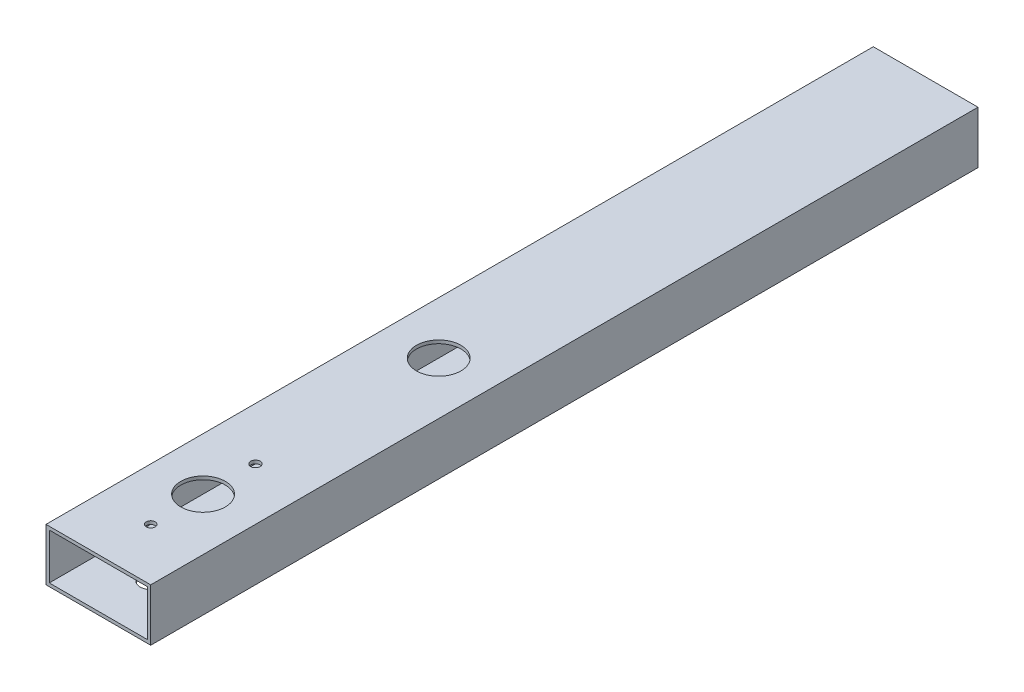
ISO-10303-21;
HEADER;
FILE_DESCRIPTION(('STEP AP214'),'2;1');
FILE_NAME('part.step','',(''),(''),'','','');
FILE_SCHEMA(('AUTOMOTIVE_DESIGN { 1 0 10303 214 1 1 1 1 }'));
ENDSEC;
DATA;
#1=APPLICATION_CONTEXT('core data for automotive mechanical design processes');
#2=APPLICATION_PROTOCOL_DEFINITION('international standard','automotive_design',2000,#1);
#3=PRODUCT_CONTEXT('',#1,'mechanical');
#4=PRODUCT('Part','Part','',(#3));
#5=PRODUCT_RELATED_PRODUCT_CATEGORY('part','',(#4));
#6=PRODUCT_DEFINITION_FORMATION('','',#4);
#7=PRODUCT_DEFINITION_CONTEXT('part definition',#1,'design');
#8=PRODUCT_DEFINITION('design','',#6,#7);
#9=PRODUCT_DEFINITION_SHAPE('','',#8);
#10=(LENGTH_UNIT() NAMED_UNIT(*) SI_UNIT(.MILLI.,.METRE.));
#11=(NAMED_UNIT(*) PLANE_ANGLE_UNIT() SI_UNIT($,.RADIAN.));
#12=(NAMED_UNIT(*) SI_UNIT($,.STERADIAN.) SOLID_ANGLE_UNIT());
#13=UNCERTAINTY_MEASURE_WITH_UNIT(LENGTH_MEASURE(1.E-05),#10,'distance_accuracy_value','');
#14=(GEOMETRIC_REPRESENTATION_CONTEXT(3) GLOBAL_UNCERTAINTY_ASSIGNED_CONTEXT((#13)) GLOBAL_UNIT_ASSIGNED_CONTEXT((#10,
#11,#12)) REPRESENTATION_CONTEXT('',''));
#15=CARTESIAN_POINT('',(0.,0.,0.));
#16=DIRECTION('',(0.,0.,1.));
#17=DIRECTION('',(1.,0.,0.));
#18=AXIS2_PLACEMENT_3D('',#15,#16,#17);
#19=CARTESIAN_POINT('',(0.,0.,401.32));
#20=DIRECTION('',(0.,0.,-1.));
#21=DIRECTION('',(-1.,0.,0.));
#22=AXIS2_PLACEMENT_3D('',#19,#20,#21);
#23=PLANE('',#22);
#24=DIRECTION('',(0.,-1.,0.));
#25=VECTOR('',#24,1.);
#26=CARTESIAN_POINT('',(0.,0.,401.32));
#27=LINE('',#26,#25);
#28=CARTESIAN_POINT('',(0.,25.4,401.32));
#29=VERTEX_POINT('',#28);
#30=CARTESIAN_POINT('',(0.,0.,401.32));
#31=VERTEX_POINT('',#30);
#32=EDGE_CURVE('E138',#29,#31,#27,.T.);
#33=ORIENTED_EDGE('',*,*,#32,.T.);
#34=DIRECTION('',(1.,0.,0.));
#35=VECTOR('',#34,1.);
#36=CARTESIAN_POINT('',(0.,0.,401.32));
#37=LINE('',#36,#35);
#38=CARTESIAN_POINT('',(50.8,0.,401.32));
#39=VERTEX_POINT('',#38);
#40=EDGE_CURVE('E141',#31,#39,#37,.T.);
#41=ORIENTED_EDGE('',*,*,#40,.T.);
#42=DIRECTION('',(0.,1.,0.));
#43=VECTOR('',#42,1.);
#44=CARTESIAN_POINT('',(50.8,0.,401.32));
#45=LINE('',#44,#43);
#46=CARTESIAN_POINT('',(50.8,25.4,401.32));
#47=VERTEX_POINT('',#46);
#48=EDGE_CURVE('E144',#39,#47,#45,.T.);
#49=ORIENTED_EDGE('',*,*,#48,.T.);
#50=DIRECTION('',(-1.,0.,0.));
#51=VECTOR('',#50,1.);
#52=CARTESIAN_POINT('',(0.,25.4,401.32));
#53=LINE('',#52,#51);
#54=EDGE_CURVE('E146',#47,#29,#53,.T.);
#55=ORIENTED_EDGE('',*,*,#54,.T.);
#56=EDGE_LOOP('',(#33,#41,#49,#55));
#57=FACE_BOUND('',#56,.T.);
#58=DIRECTION('',(1.,0.,0.));
#59=VECTOR('',#58,1.);
#60=CARTESIAN_POINT('',(1.5875,1.5875,401.32));
#61=LINE('',#60,#59);
#62=CARTESIAN_POINT('',(1.5875,1.5875,401.32));
#63=VERTEX_POINT('',#62);
#64=CARTESIAN_POINT('',(49.2125,1.5875,401.32));
#65=VERTEX_POINT('',#64);
#66=EDGE_CURVE('E100',#63,#65,#61,.T.);
#67=ORIENTED_EDGE('',*,*,#66,.F.);
#68=DIRECTION('',(0.,-1.,0.));
#69=VECTOR('',#68,1.);
#70=CARTESIAN_POINT('',(1.5875,1.5875,401.32));
#71=LINE('',#70,#69);
#72=CARTESIAN_POINT('',(1.5875,23.8125,401.32));
#73=VERTEX_POINT('',#72);
#74=EDGE_CURVE('E122',#73,#63,#71,.T.);
#75=ORIENTED_EDGE('',*,*,#74,.F.);
#76=DIRECTION('',(-1.,0.,0.));
#77=VECTOR('',#76,1.);
#78=CARTESIAN_POINT('',(1.5875,23.8125,401.32));
#79=LINE('',#78,#77);
#80=CARTESIAN_POINT('',(49.2125,23.8125,401.32));
#81=VERTEX_POINT('',#80);
#82=EDGE_CURVE('E120',#81,#73,#79,.T.);
#83=ORIENTED_EDGE('',*,*,#82,.F.);
#84=DIRECTION('',(0.,1.,0.));
#85=VECTOR('',#84,1.);
#86=CARTESIAN_POINT('',(49.2125,1.5875,401.32));
#87=LINE('',#86,#85);
#88=EDGE_CURVE('E108',#65,#81,#87,.T.);
#89=ORIENTED_EDGE('',*,*,#88,.F.);
#90=EDGE_LOOP('',(#67,#75,#83,#89));
#91=FACE_BOUND('',#90,.T.);
#92=ADVANCED_FACE('F33',(#57,#91),#23,.F.);
#93=CARTESIAN_POINT('',(0.,0.,0.));
#94=DIRECTION('',(0.,0.,-1.));
#95=DIRECTION('',(-1.,0.,0.));
#96=AXIS2_PLACEMENT_3D('',#93,#94,#95);
#97=PLANE('',#96);
#98=DIRECTION('',(0.,-1.,0.));
#99=VECTOR('',#98,1.);
#100=CARTESIAN_POINT('',(0.,0.,0.));
#101=LINE('',#100,#99);
#102=CARTESIAN_POINT('',(0.,25.4,0.));
#103=VERTEX_POINT('',#102);
#104=CARTESIAN_POINT('',(0.,0.,0.));
#105=VERTEX_POINT('',#104);
#106=EDGE_CURVE('E116',#103,#105,#101,.T.);
#107=ORIENTED_EDGE('',*,*,#106,.F.);
#108=DIRECTION('',(-1.,0.,0.));
#109=VECTOR('',#108,1.);
#110=CARTESIAN_POINT('',(0.,25.4,0.));
#111=LINE('',#110,#109);
#112=CARTESIAN_POINT('',(50.8,25.4,0.));
#113=VERTEX_POINT('',#112);
#114=EDGE_CURVE('E142',#113,#103,#111,.T.);
#115=ORIENTED_EDGE('',*,*,#114,.F.);
#116=DIRECTION('',(0.,1.,0.));
#117=VECTOR('',#116,1.);
#118=CARTESIAN_POINT('',(50.8,0.,0.));
#119=LINE('',#118,#117);
#120=CARTESIAN_POINT('',(50.8,0.,0.));
#121=VERTEX_POINT('',#120);
#122=EDGE_CURVE('E153',#121,#113,#119,.T.);
#123=ORIENTED_EDGE('',*,*,#122,.F.);
#124=DIRECTION('',(1.,0.,0.));
#125=VECTOR('',#124,1.);
#126=CARTESIAN_POINT('',(0.,0.,0.));
#127=LINE('',#126,#125);
#128=EDGE_CURVE('E151',#105,#121,#127,.T.);
#129=ORIENTED_EDGE('',*,*,#128,.F.);
#130=EDGE_LOOP('',(#107,#115,#123,#129));
#131=FACE_BOUND('',#130,.T.);
#132=DIRECTION('',(0.,-1.,0.));
#133=VECTOR('',#132,1.);
#134=CARTESIAN_POINT('',(1.5875,1.5875,0.));
#135=LINE('',#134,#133);
#136=CARTESIAN_POINT('',(1.5875,23.8125,0.));
#137=VERTEX_POINT('',#136);
#138=CARTESIAN_POINT('',(1.5875,1.5875,0.));
#139=VERTEX_POINT('',#138);
#140=EDGE_CURVE('E109',#137,#139,#135,.T.);
#141=ORIENTED_EDGE('',*,*,#140,.T.);
#142=DIRECTION('',(1.,0.,0.));
#143=VECTOR('',#142,1.);
#144=CARTESIAN_POINT('',(1.5875,1.5875,0.));
#145=LINE('',#144,#143);
#146=CARTESIAN_POINT('',(49.2125,1.5875,0.));
#147=VERTEX_POINT('',#146);
#148=EDGE_CURVE('E58',#139,#147,#145,.T.);
#149=ORIENTED_EDGE('',*,*,#148,.T.);
#150=DIRECTION('',(0.,1.,0.));
#151=VECTOR('',#150,1.);
#152=CARTESIAN_POINT('',(49.2125,1.5875,0.));
#153=LINE('',#152,#151);
#154=CARTESIAN_POINT('',(49.2125,23.8125,0.));
#155=VERTEX_POINT('',#154);
#156=EDGE_CURVE('E115',#147,#155,#153,.T.);
#157=ORIENTED_EDGE('',*,*,#156,.T.);
#158=DIRECTION('',(-1.,0.,0.));
#159=VECTOR('',#158,1.);
#160=CARTESIAN_POINT('',(1.5875,23.8125,0.));
#161=LINE('',#160,#159);
#162=EDGE_CURVE('E130',#155,#137,#161,.T.);
#163=ORIENTED_EDGE('',*,*,#162,.T.);
#164=EDGE_LOOP('',(#141,#149,#157,#163));
#165=FACE_BOUND('',#164,.T.);
#166=ADVANCED_FACE('F218',(#131,#165),#97,.T.);
#167=CARTESIAN_POINT('',(0.,0.,401.32));
#168=DIRECTION('',(1.,0.,0.));
#169=DIRECTION('',(0.,0.,-1.));
#170=AXIS2_PLACEMENT_3D('',#167,#168,#169);
#171=PLANE('',#170);
#172=ORIENTED_EDGE('',*,*,#106,.T.);
#173=DIRECTION('',(0.,0.,-1.));
#174=VECTOR('',#173,1.);
#175=CARTESIAN_POINT('',(0.,0.,401.32));
#176=LINE('',#175,#174);
#177=EDGE_CURVE('E11',#31,#105,#176,.T.);
#178=ORIENTED_EDGE('',*,*,#177,.F.);
#179=ORIENTED_EDGE('',*,*,#32,.F.);
#180=DIRECTION('',(0.,0.,-1.));
#181=VECTOR('',#180,1.);
#182=CARTESIAN_POINT('',(0.,25.4,401.32));
#183=LINE('',#182,#181);
#184=EDGE_CURVE('E148',#29,#103,#183,.T.);
#185=ORIENTED_EDGE('',*,*,#184,.T.);
#186=EDGE_LOOP('',(#172,#178,#179,#185));
#187=FACE_BOUND('',#186,.T.);
#188=ADVANCED_FACE('F35',(#187),#171,.F.);
#189=CARTESIAN_POINT('',(0.,0.,401.32));
#190=DIRECTION('',(0.,1.,0.));
#191=DIRECTION('',(0.,0.,1.));
#192=AXIS2_PLACEMENT_3D('',#189,#190,#191);
#193=PLANE('',#192);
#194=CARTESIAN_POINT('',(25.4,0.,325.12));
#195=DIRECTION('',(0.,1.,0.));
#196=DIRECTION('',(0.,0.,1.));
#197=AXIS2_PLACEMENT_3D('',#194,#195,#196);
#198=CIRCLE('',#197,5.08000000000001);
#199=CARTESIAN_POINT('',(25.4,0.,330.2));
#200=VERTEX_POINT('',#199);
#201=EDGE_CURVE('E290',#200,#200,#198,.T.);
#202=ORIENTED_EDGE('',*,*,#201,.T.);
#203=EDGE_LOOP('',(#202));
#204=FACE_BOUND('',#203,.T.);
#205=CARTESIAN_POINT('',(25.4,0.,375.92));
#206=DIRECTION('',(0.,1.,0.));
#207=DIRECTION('',(0.,0.,1.));
#208=AXIS2_PLACEMENT_3D('',#205,#206,#207);
#209=CIRCLE('',#208,5.08000000000001);
#210=CARTESIAN_POINT('',(25.4,0.,381.));
#211=VERTEX_POINT('',#210);
#212=EDGE_CURVE('E179',#211,#211,#209,.T.);
#213=ORIENTED_EDGE('',*,*,#212,.T.);
#214=EDGE_LOOP('',(#213));
#215=FACE_BOUND('',#214,.T.);
#216=CARTESIAN_POINT('',(25.4,0.,350.52));
#217=DIRECTION('',(0.,1.,0.));
#218=DIRECTION('',(0.,0.,1.));
#219=AXIS2_PLACEMENT_3D('',#216,#217,#218);
#220=CIRCLE('',#219,14.351);
#221=CARTESIAN_POINT('',(25.4,0.,364.871));
#222=VERTEX_POINT('',#221);
#223=EDGE_CURVE('E176',#222,#222,#220,.T.);
#224=ORIENTED_EDGE('',*,*,#223,.T.);
#225=EDGE_LOOP('',(#224));
#226=FACE_BOUND('',#225,.T.);
#227=CARTESIAN_POINT('',(25.4,0.,236.22));
#228=DIRECTION('',(0.,1.,0.));
#229=DIRECTION('',(0.,0.,1.));
#230=AXIS2_PLACEMENT_3D('',#227,#228,#229);
#231=CIRCLE('',#230,14.351);
#232=CARTESIAN_POINT('',(25.4,0.,250.571));
#233=VERTEX_POINT('',#232);
#234=EDGE_CURVE('E193',#233,#233,#231,.T.);
#235=ORIENTED_EDGE('',*,*,#234,.T.);
#236=EDGE_LOOP('',(#235));
#237=FACE_BOUND('',#236,.T.);
#238=ORIENTED_EDGE('',*,*,#128,.T.);
#239=DIRECTION('',(0.,0.,-1.));
#240=VECTOR('',#239,1.);
#241=CARTESIAN_POINT('',(50.8,0.,401.32));
#242=LINE('',#241,#240);
#243=EDGE_CURVE('E42',#39,#121,#242,.T.);
#244=ORIENTED_EDGE('',*,*,#243,.F.);
#245=ORIENTED_EDGE('',*,*,#40,.F.);
#246=ORIENTED_EDGE('',*,*,#177,.T.);
#247=EDGE_LOOP('',(#238,#244,#245,#246));
#248=FACE_BOUND('',#247,.T.);
#249=ADVANCED_FACE('F222',(#204,#215,#226,#237,#248),#193,.F.);
#250=CARTESIAN_POINT('',(50.8,0.,401.32));
#251=DIRECTION('',(-1.,0.,0.));
#252=DIRECTION('',(0.,0.,1.));
#253=AXIS2_PLACEMENT_3D('',#250,#251,#252);
#254=PLANE('',#253);
#255=ORIENTED_EDGE('',*,*,#122,.T.);
#256=DIRECTION('',(0.,0.,-1.));
#257=VECTOR('',#256,1.);
#258=CARTESIAN_POINT('',(50.8,25.4,401.32));
#259=LINE('',#258,#257);
#260=EDGE_CURVE('E158',#47,#113,#259,.T.);
#261=ORIENTED_EDGE('',*,*,#260,.F.);
#262=ORIENTED_EDGE('',*,*,#48,.F.);
#263=ORIENTED_EDGE('',*,*,#243,.T.);
#264=EDGE_LOOP('',(#255,#261,#262,#263));
#265=FACE_BOUND('',#264,.T.);
#266=ADVANCED_FACE('F205',(#265),#254,.F.);
#267=CARTESIAN_POINT('',(0.,25.4,401.32));
#268=DIRECTION('',(0.,-1.,0.));
#269=DIRECTION('',(0.,0.,-1.));
#270=AXIS2_PLACEMENT_3D('',#267,#268,#269);
#271=PLANE('',#270);
#272=CARTESIAN_POINT('',(25.4,25.4,325.12));
#273=DIRECTION('',(0.,1.,0.));
#274=DIRECTION('',(0.,0.,1.));
#275=AXIS2_PLACEMENT_3D('',#272,#273,#274);
#276=CIRCLE('',#275,2.28600000000001);
#277=CARTESIAN_POINT('',(25.4,25.4,327.406));
#278=VERTEX_POINT('',#277);
#279=EDGE_CURVE('E291',#278,#278,#276,.T.);
#280=ORIENTED_EDGE('',*,*,#279,.F.);
#281=EDGE_LOOP('',(#280));
#282=FACE_BOUND('',#281,.T.);
#283=CARTESIAN_POINT('',(25.4,25.4,375.92));
#284=DIRECTION('',(0.,1.,0.));
#285=DIRECTION('',(0.,0.,1.));
#286=AXIS2_PLACEMENT_3D('',#283,#284,#285);
#287=CIRCLE('',#286,2.15900000000001);
#288=CARTESIAN_POINT('',(25.4,25.4,378.079));
#289=VERTEX_POINT('',#288);
#290=EDGE_CURVE('E172',#289,#289,#287,.T.);
#291=ORIENTED_EDGE('',*,*,#290,.F.);
#292=EDGE_LOOP('',(#291));
#293=FACE_BOUND('',#292,.T.);
#294=CARTESIAN_POINT('',(25.4,25.4,350.52));
#295=DIRECTION('',(0.,1.,0.));
#296=DIRECTION('',(0.,0.,1.));
#297=AXIS2_PLACEMENT_3D('',#294,#295,#296);
#298=CIRCLE('',#297,10.795);
#299=CARTESIAN_POINT('',(25.4,25.4,361.315));
#300=VERTEX_POINT('',#299);
#301=EDGE_CURVE('E168',#300,#300,#298,.T.);
#302=ORIENTED_EDGE('',*,*,#301,.F.);
#303=EDGE_LOOP('',(#302));
#304=FACE_BOUND('',#303,.T.);
#305=CARTESIAN_POINT('',(25.4,25.4,236.22));
#306=DIRECTION('',(0.,1.,0.));
#307=DIRECTION('',(0.,0.,1.));
#308=AXIS2_PLACEMENT_3D('',#305,#306,#307);
#309=CIRCLE('',#308,10.795);
#310=CARTESIAN_POINT('',(25.4,25.4,247.015));
#311=VERTEX_POINT('',#310);
#312=EDGE_CURVE('E165',#311,#311,#309,.T.);
#313=ORIENTED_EDGE('',*,*,#312,.F.);
#314=EDGE_LOOP('',(#313));
#315=FACE_BOUND('',#314,.T.);
#316=ORIENTED_EDGE('',*,*,#114,.T.);
#317=ORIENTED_EDGE('',*,*,#184,.F.);
#318=ORIENTED_EDGE('',*,*,#54,.F.);
#319=ORIENTED_EDGE('',*,*,#260,.T.);
#320=EDGE_LOOP('',(#316,#317,#318,#319));
#321=FACE_BOUND('',#320,.T.);
#322=ADVANCED_FACE('F202',(#282,#293,#304,#315,#321),#271,.F.);
#323=CARTESIAN_POINT('',(1.5875,1.5875,401.32));
#324=DIRECTION('',(0.,1.,0.));
#325=DIRECTION('',(0.,0.,1.));
#326=AXIS2_PLACEMENT_3D('',#323,#324,#325);
#327=PLANE('',#326);
#328=CARTESIAN_POINT('',(25.4,1.5875,325.12));
#329=DIRECTION('',(0.,1.,0.));
#330=DIRECTION('',(0.,0.,1.));
#331=AXIS2_PLACEMENT_3D('',#328,#329,#330);
#332=CIRCLE('',#331,5.08000000000001);
#333=CARTESIAN_POINT('',(25.4,1.5875,330.2));
#334=VERTEX_POINT('',#333);
#335=EDGE_CURVE('E287',#334,#334,#332,.T.);
#336=ORIENTED_EDGE('',*,*,#335,.F.);
#337=EDGE_LOOP('',(#336));
#338=FACE_BOUND('',#337,.T.);
#339=CARTESIAN_POINT('',(25.4,1.5875,375.92));
#340=DIRECTION('',(0.,1.,0.));
#341=DIRECTION('',(0.,0.,1.));
#342=AXIS2_PLACEMENT_3D('',#339,#340,#341);
#343=CIRCLE('',#342,5.08000000000001);
#344=CARTESIAN_POINT('',(25.4,1.5875,381.));
#345=VERTEX_POINT('',#344);
#346=EDGE_CURVE('E184',#345,#345,#343,.T.);
#347=ORIENTED_EDGE('',*,*,#346,.F.);
#348=EDGE_LOOP('',(#347));
#349=FACE_BOUND('',#348,.T.);
#350=CARTESIAN_POINT('',(25.4,1.5875,350.52));
#351=DIRECTION('',(0.,1.,0.));
#352=DIRECTION('',(0.,0.,1.));
#353=AXIS2_PLACEMENT_3D('',#350,#351,#352);
#354=CIRCLE('',#353,14.351);
#355=CARTESIAN_POINT('',(25.4,1.5875,364.871));
#356=VERTEX_POINT('',#355);
#357=EDGE_CURVE('E171',#356,#356,#354,.T.);
#358=ORIENTED_EDGE('',*,*,#357,.F.);
#359=EDGE_LOOP('',(#358));
#360=FACE_BOUND('',#359,.T.);
#361=CARTESIAN_POINT('',(25.4,1.5875,236.22));
#362=DIRECTION('',(0.,1.,0.));
#363=DIRECTION('',(0.,0.,1.));
#364=AXIS2_PLACEMENT_3D('',#361,#362,#363);
#365=CIRCLE('',#364,14.351);
#366=CARTESIAN_POINT('',(25.4,1.5875,250.571));
#367=VERTEX_POINT('',#366);
#368=EDGE_CURVE('E190',#367,#367,#365,.T.);
#369=ORIENTED_EDGE('',*,*,#368,.F.);
#370=EDGE_LOOP('',(#369));
#371=FACE_BOUND('',#370,.T.);
#372=ORIENTED_EDGE('',*,*,#148,.F.);
#373=DIRECTION('',(0.,0.,-1.));
#374=VECTOR('',#373,1.);
#375=CARTESIAN_POINT('',(1.5875,1.5875,401.32));
#376=LINE('',#375,#374);
#377=EDGE_CURVE('E104',#63,#139,#376,.T.);
#378=ORIENTED_EDGE('',*,*,#377,.F.);
#379=ORIENTED_EDGE('',*,*,#66,.T.);
#380=DIRECTION('',(0.,0.,-1.));
#381=VECTOR('',#380,1.);
#382=CARTESIAN_POINT('',(49.2125,1.5875,401.32));
#383=LINE('',#382,#381);
#384=EDGE_CURVE('E103',#65,#147,#383,.T.);
#385=ORIENTED_EDGE('',*,*,#384,.T.);
#386=EDGE_LOOP('',(#372,#378,#379,#385));
#387=FACE_BOUND('',#386,.T.);
#388=ADVANCED_FACE('F102',(#338,#349,#360,#371,#387),#327,.T.);
#389=CARTESIAN_POINT('',(49.2125,1.5875,401.32));
#390=DIRECTION('',(-1.,0.,0.));
#391=DIRECTION('',(0.,0.,1.));
#392=AXIS2_PLACEMENT_3D('',#389,#390,#391);
#393=PLANE('',#392);
#394=ORIENTED_EDGE('',*,*,#156,.F.);
#395=ORIENTED_EDGE('',*,*,#384,.F.);
#396=ORIENTED_EDGE('',*,*,#88,.T.);
#397=DIRECTION('',(0.,0.,-1.));
#398=VECTOR('',#397,1.);
#399=CARTESIAN_POINT('',(49.2125,23.8125,401.32));
#400=LINE('',#399,#398);
#401=EDGE_CURVE('E117',#81,#155,#400,.T.);
#402=ORIENTED_EDGE('',*,*,#401,.T.);
#403=EDGE_LOOP('',(#394,#395,#396,#402));
#404=FACE_BOUND('',#403,.T.);
#405=ADVANCED_FACE('F112',(#404),#393,.T.);
#406=CARTESIAN_POINT('',(1.5875,23.8125,401.32));
#407=DIRECTION('',(0.,-1.,0.));
#408=DIRECTION('',(0.,0.,-1.));
#409=AXIS2_PLACEMENT_3D('',#406,#407,#408);
#410=PLANE('',#409);
#411=CARTESIAN_POINT('',(25.4,23.8125,325.12));
#412=DIRECTION('',(0.,-1.,0.));
#413=DIRECTION('',(0.,0.,-1.));
#414=AXIS2_PLACEMENT_3D('',#411,#412,#413);
#415=CIRCLE('',#414,2.28600000000001);
#416=CARTESIAN_POINT('',(25.4,23.8125,322.834));
#417=VERTEX_POINT('',#416);
#418=EDGE_CURVE('E37',#417,#417,#415,.T.);
#419=ORIENTED_EDGE('',*,*,#418,.F.);
#420=EDGE_LOOP('',(#419));
#421=FACE_BOUND('',#420,.T.);
#422=CARTESIAN_POINT('',(25.4,23.8125,375.92));
#423=DIRECTION('',(0.,-1.,0.));
#424=DIRECTION('',(0.,0.,-1.));
#425=AXIS2_PLACEMENT_3D('',#422,#423,#424);
#426=CIRCLE('',#425,2.15900000000001);
#427=CARTESIAN_POINT('',(25.4,23.8125,373.761));
#428=VERTEX_POINT('',#427);
#429=EDGE_CURVE('E169',#428,#428,#426,.T.);
#430=ORIENTED_EDGE('',*,*,#429,.F.);
#431=EDGE_LOOP('',(#430));
#432=FACE_BOUND('',#431,.T.);
#433=CARTESIAN_POINT('',(25.4,23.8125,350.52));
#434=DIRECTION('',(0.,-1.,0.));
#435=DIRECTION('',(0.,0.,-1.));
#436=AXIS2_PLACEMENT_3D('',#433,#434,#435);
#437=CIRCLE('',#436,10.795);
#438=CARTESIAN_POINT('',(25.4,23.8125,339.725));
#439=VERTEX_POINT('',#438);
#440=EDGE_CURVE('E166',#439,#439,#437,.T.);
#441=ORIENTED_EDGE('',*,*,#440,.F.);
#442=EDGE_LOOP('',(#441));
#443=FACE_BOUND('',#442,.T.);
#444=CARTESIAN_POINT('',(25.4,23.8125,236.22));
#445=DIRECTION('',(0.,-1.,0.));
#446=DIRECTION('',(0.,0.,-1.));
#447=AXIS2_PLACEMENT_3D('',#444,#445,#446);
#448=CIRCLE('',#447,10.795);
#449=CARTESIAN_POINT('',(25.4,23.8125,225.425));
#450=VERTEX_POINT('',#449);
#451=EDGE_CURVE('E128',#450,#450,#448,.T.);
#452=ORIENTED_EDGE('',*,*,#451,.F.);
#453=EDGE_LOOP('',(#452));
#454=FACE_BOUND('',#453,.T.);
#455=ORIENTED_EDGE('',*,*,#162,.F.);
#456=ORIENTED_EDGE('',*,*,#401,.F.);
#457=ORIENTED_EDGE('',*,*,#82,.T.);
#458=DIRECTION('',(0.,0.,-1.));
#459=VECTOR('',#458,1.);
#460=CARTESIAN_POINT('',(1.5875,23.8125,401.32));
#461=LINE('',#460,#459);
#462=EDGE_CURVE('E50',#73,#137,#461,.T.);
#463=ORIENTED_EDGE('',*,*,#462,.T.);
#464=EDGE_LOOP('',(#455,#456,#457,#463));
#465=FACE_BOUND('',#464,.T.);
#466=ADVANCED_FACE('F246',(#421,#432,#443,#454,#465),#410,.T.);
#467=CARTESIAN_POINT('',(1.5875,1.5875,401.32));
#468=DIRECTION('',(1.,0.,0.));
#469=DIRECTION('',(0.,0.,-1.));
#470=AXIS2_PLACEMENT_3D('',#467,#468,#469);
#471=PLANE('',#470);
#472=ORIENTED_EDGE('',*,*,#140,.F.);
#473=ORIENTED_EDGE('',*,*,#462,.F.);
#474=ORIENTED_EDGE('',*,*,#74,.T.);
#475=ORIENTED_EDGE('',*,*,#377,.T.);
#476=EDGE_LOOP('',(#472,#473,#474,#475));
#477=FACE_BOUND('',#476,.T.);
#478=ADVANCED_FACE('F249',(#477),#471,.T.);
#479=CARTESIAN_POINT('',(25.4,22.86,236.22));
#480=DIRECTION('',(0.,1.,0.));
#481=DIRECTION('',(0.,0.,1.));
#482=AXIS2_PLACEMENT_3D('',#479,#480,#481);
#483=CYLINDRICAL_SURFACE('',#482,10.795);
#484=ORIENTED_EDGE('',*,*,#451,.T.);
#485=EDGE_LOOP('',(#484));
#486=FACE_BOUND('',#485,.T.);
#487=ORIENTED_EDGE('',*,*,#312,.T.);
#488=EDGE_LOOP('',(#487));
#489=FACE_BOUND('',#488,.T.);
#490=ADVANCED_FACE('F200',(#486,#489),#483,.F.);
#491=CARTESIAN_POINT('',(25.4,20.48,350.52));
#492=DIRECTION('',(0.,1.,0.));
#493=DIRECTION('',(0.,0.,1.));
#494=AXIS2_PLACEMENT_3D('',#491,#492,#493);
#495=CYLINDRICAL_SURFACE('',#494,10.795);
#496=ORIENTED_EDGE('',*,*,#440,.T.);
#497=EDGE_LOOP('',(#496));
#498=FACE_BOUND('',#497,.T.);
#499=ORIENTED_EDGE('',*,*,#301,.T.);
#500=EDGE_LOOP('',(#499));
#501=FACE_BOUND('',#500,.T.);
#502=ADVANCED_FACE('F255',(#498,#501),#495,.F.);
#503=CARTESIAN_POINT('',(25.4,-11.1125,236.22));
#504=DIRECTION('',(0.,1.,0.));
#505=DIRECTION('',(0.,0.,1.));
#506=AXIS2_PLACEMENT_3D('',#503,#504,#505);
#507=CYLINDRICAL_SURFACE('',#506,14.351);
#508=CARTESIAN_POINT('',(25.4,1.5875,250.571));
#509=CARTESIAN_POINT('',(25.4,1.57096354166667,250.571));
#510=CARTESIAN_POINT('',(25.4,1.55442708333333,250.571));
#511=CARTESIAN_POINT('',(25.4,1.52135416666667,250.571));
#512=CARTESIAN_POINT('',(25.4,1.50481770833333,250.571));
#513=CARTESIAN_POINT('',(25.4,1.47174479166667,250.571));
#514=CARTESIAN_POINT('',(25.4,1.45520833333333,250.571));
#515=CARTESIAN_POINT('',(25.4,1.42213541666667,250.571));
#516=CARTESIAN_POINT('',(25.4,1.40559895833333,250.571));
#517=CARTESIAN_POINT('',(25.4,1.37252604166667,250.571));
#518=CARTESIAN_POINT('',(25.4,1.35598958333333,250.571));
#519=CARTESIAN_POINT('',(25.4,1.32291666666667,250.571));
#520=CARTESIAN_POINT('',(25.4,1.30638020833333,250.571));
#521=CARTESIAN_POINT('',(25.4,1.27330729166667,250.571));
#522=CARTESIAN_POINT('',(25.4,1.25677083333333,250.571));
#523=CARTESIAN_POINT('',(25.4,1.22369791666667,250.571));
#524=CARTESIAN_POINT('',(25.4,1.20716145833333,250.571));
#525=CARTESIAN_POINT('',(25.4,1.17408854166667,250.571));
#526=CARTESIAN_POINT('',(25.4,1.15755208333333,250.571));
#527=CARTESIAN_POINT('',(25.4,1.12447916666667,250.571));
#528=CARTESIAN_POINT('',(25.4,1.10794270833333,250.571));
#529=CARTESIAN_POINT('',(25.4,1.07486979166667,250.571));
#530=CARTESIAN_POINT('',(25.4,1.05833333333333,250.571));
#531=CARTESIAN_POINT('',(25.4,1.02526041666667,250.571));
#532=CARTESIAN_POINT('',(25.4,1.00872395833333,250.571));
#533=CARTESIAN_POINT('',(25.4,0.975651041666666,250.571));
#534=CARTESIAN_POINT('',(25.4,0.959114583333333,250.571));
#535=CARTESIAN_POINT('',(25.4,0.926041666666666,250.571));
#536=CARTESIAN_POINT('',(25.4,0.909505208333332,250.571));
#537=CARTESIAN_POINT('',(25.4,0.876432291666666,250.571));
#538=CARTESIAN_POINT('',(25.4,0.859895833333333,250.571));
#539=CARTESIAN_POINT('',(25.4,0.826822916666666,250.571));
#540=CARTESIAN_POINT('',(25.4,0.810286458333333,250.571));
#541=CARTESIAN_POINT('',(25.4,0.777213541666666,250.571));
#542=CARTESIAN_POINT('',(25.4,0.760677083333332,250.571));
#543=CARTESIAN_POINT('',(25.4,0.727604166666666,250.571));
#544=CARTESIAN_POINT('',(25.4,0.711067708333333,250.571));
#545=CARTESIAN_POINT('',(25.4,0.677994791666666,250.571));
#546=CARTESIAN_POINT('',(25.4,0.661458333333333,250.571));
#547=CARTESIAN_POINT('',(25.4,0.628385416666666,250.571));
#548=CARTESIAN_POINT('',(25.4,0.611848958333332,250.571));
#549=CARTESIAN_POINT('',(25.4,0.578776041666666,250.571));
#550=CARTESIAN_POINT('',(25.4,0.562239583333333,250.571));
#551=CARTESIAN_POINT('',(25.4,0.529166666666666,250.571));
#552=CARTESIAN_POINT('',(25.4,0.512630208333333,250.571));
#553=CARTESIAN_POINT('',(25.4,0.479557291666666,250.571));
#554=CARTESIAN_POINT('',(25.4,0.463020833333332,250.571));
#555=CARTESIAN_POINT('',(25.4,0.429947916666666,250.571));
#556=CARTESIAN_POINT('',(25.4,0.413411458333333,250.571));
#557=CARTESIAN_POINT('',(25.4,0.380338541666666,250.571));
#558=CARTESIAN_POINT('',(25.4,0.363802083333333,250.571));
#559=CARTESIAN_POINT('',(25.4,0.330729166666666,250.571));
#560=CARTESIAN_POINT('',(25.4,0.314192708333332,250.571));
#561=CARTESIAN_POINT('',(25.4,0.281119791666665,250.571));
#562=CARTESIAN_POINT('',(25.4,0.264583333333333,250.571));
#563=CARTESIAN_POINT('',(25.4,0.231510416666666,250.571));
#564=CARTESIAN_POINT('',(25.4,0.214973958333332,250.571));
#565=CARTESIAN_POINT('',(25.4,0.181901041666665,250.571));
#566=CARTESIAN_POINT('',(25.4,0.165364583333332,250.571));
#567=CARTESIAN_POINT('',(25.4,0.132291666666665,250.571));
#568=CARTESIAN_POINT('',(25.4,0.115755208333331,250.571));
#569=CARTESIAN_POINT('',(25.4,0.0826822916666648,250.571));
#570=CARTESIAN_POINT('',(25.4,0.0661458333333318,250.571));
#571=CARTESIAN_POINT('',(25.4,0.0330729166666653,250.571));
#572=CARTESIAN_POINT('',(25.4,0.0165364583333318,250.571));
#573=CARTESIAN_POINT('',(25.4,0.,250.571));
#574=B_SPLINE_CURVE_WITH_KNOTS('',3,(#508,#509,#510,#511,#512,#513,#514,#515,#516,#517,#518,
#519,#520,#521,#522,#523,#524,#525,#526,#527,#528,#529,#530,#531,#532,#533,#534,#535,#536,#537,
#538,#539,#540,#541,#542,#543,#544,#545,#546,#547,#548,#549,#550,#551,#552,#553,#554,#555,#556,
#557,#558,#559,#560,#561,#562,#563,#564,#565,#566,#567,#568,#569,#570,#571,#572,#573),
.UNSPECIFIED.,.F.,.F.,(4,2,2,2,2,2,2,2,2,2,2,2,2,2,2,2,2,2,2,2,2,2,2,2,2,2,2,2,2,2,2,2,4),(0.,
0.0496093750000006,0.0992187499999995,0.148828125,0.198437500000001,0.248046875,0.29765625,
0.347265625000001,0.396875000000001,0.446484375,0.496093750000001,0.545703125000002,0.5953125,
0.644921875000001,0.694531250000002,0.744140625,0.793750000000001,0.843359375000002,
0.892968750000001,0.942578125000001,0.992187500000002,1.041796875,1.09140625,1.141015625,
1.190625,1.240234375,1.28984375,1.339453125,1.3890625,1.438671875,1.48828125,1.537890625,
1.5875),.UNSPECIFIED.);
#575=EDGE_CURVE('BSEAM259',#367,#233,#574,.T.);
#576=ORIENTED_EDGE('',*,*,#368,.T.);
#577=ORIENTED_EDGE('',*,*,#234,.F.);
#578=ORIENTED_EDGE('',*,*,#575,.T.);
#579=ORIENTED_EDGE('',*,*,#575,.F.);
#580=EDGE_LOOP('',(#576,#578,#577,#579));
#581=FACE_BOUND('',#580,.T.);
#582=ADVANCED_FACE('F259',(#581),#507,.F.);
#583=CARTESIAN_POINT('',(25.4,-11.1125,350.52));
#584=DIRECTION('',(0.,1.,0.));
#585=DIRECTION('',(0.,0.,1.));
#586=AXIS2_PLACEMENT_3D('',#583,#584,#585);
#587=CYLINDRICAL_SURFACE('',#586,14.351);
#588=CARTESIAN_POINT('',(25.4,1.5875,364.871));
#589=CARTESIAN_POINT('',(25.4,1.57096354166667,364.871));
#590=CARTESIAN_POINT('',(25.4,1.55442708333333,364.871));
#591=CARTESIAN_POINT('',(25.4,1.52135416666667,364.871));
#592=CARTESIAN_POINT('',(25.4,1.50481770833333,364.871));
#593=CARTESIAN_POINT('',(25.4,1.47174479166667,364.871));
#594=CARTESIAN_POINT('',(25.4,1.45520833333333,364.871));
#595=CARTESIAN_POINT('',(25.4,1.42213541666667,364.871));
#596=CARTESIAN_POINT('',(25.4,1.40559895833333,364.871));
#597=CARTESIAN_POINT('',(25.4,1.37252604166667,364.871));
#598=CARTESIAN_POINT('',(25.4,1.35598958333333,364.871));
#599=CARTESIAN_POINT('',(25.4,1.32291666666667,364.871));
#600=CARTESIAN_POINT('',(25.4,1.30638020833333,364.871));
#601=CARTESIAN_POINT('',(25.4,1.27330729166667,364.871));
#602=CARTESIAN_POINT('',(25.4,1.25677083333333,364.871));
#603=CARTESIAN_POINT('',(25.4,1.22369791666667,364.871));
#604=CARTESIAN_POINT('',(25.4,1.20716145833333,364.871));
#605=CARTESIAN_POINT('',(25.4,1.17408854166667,364.871));
#606=CARTESIAN_POINT('',(25.4,1.15755208333333,364.871));
#607=CARTESIAN_POINT('',(25.4,1.12447916666667,364.871));
#608=CARTESIAN_POINT('',(25.4,1.10794270833333,364.871));
#609=CARTESIAN_POINT('',(25.4,1.07486979166667,364.871));
#610=CARTESIAN_POINT('',(25.4,1.05833333333333,364.871));
#611=CARTESIAN_POINT('',(25.4,1.02526041666667,364.871));
#612=CARTESIAN_POINT('',(25.4,1.00872395833333,364.871));
#613=CARTESIAN_POINT('',(25.4,0.975651041666666,364.871));
#614=CARTESIAN_POINT('',(25.4,0.959114583333333,364.871));
#615=CARTESIAN_POINT('',(25.4,0.926041666666666,364.871));
#616=CARTESIAN_POINT('',(25.4,0.909505208333332,364.871));
#617=CARTESIAN_POINT('',(25.4,0.876432291666666,364.871));
#618=CARTESIAN_POINT('',(25.4,0.859895833333333,364.871));
#619=CARTESIAN_POINT('',(25.4,0.826822916666666,364.871));
#620=CARTESIAN_POINT('',(25.4,0.810286458333333,364.871));
#621=CARTESIAN_POINT('',(25.4,0.777213541666666,364.871));
#622=CARTESIAN_POINT('',(25.4,0.760677083333332,364.871));
#623=CARTESIAN_POINT('',(25.4,0.727604166666666,364.871));
#624=CARTESIAN_POINT('',(25.4,0.711067708333333,364.871));
#625=CARTESIAN_POINT('',(25.4,0.677994791666666,364.871));
#626=CARTESIAN_POINT('',(25.4,0.661458333333333,364.871));
#627=CARTESIAN_POINT('',(25.4,0.628385416666666,364.871));
#628=CARTESIAN_POINT('',(25.4,0.611848958333332,364.871));
#629=CARTESIAN_POINT('',(25.4,0.578776041666666,364.871));
#630=CARTESIAN_POINT('',(25.4,0.562239583333333,364.871));
#631=CARTESIAN_POINT('',(25.4,0.529166666666666,364.871));
#632=CARTESIAN_POINT('',(25.4,0.512630208333333,364.871));
#633=CARTESIAN_POINT('',(25.4,0.479557291666666,364.871));
#634=CARTESIAN_POINT('',(25.4,0.463020833333332,364.871));
#635=CARTESIAN_POINT('',(25.4,0.429947916666666,364.871));
#636=CARTESIAN_POINT('',(25.4,0.413411458333333,364.871));
#637=CARTESIAN_POINT('',(25.4,0.380338541666666,364.871));
#638=CARTESIAN_POINT('',(25.4,0.363802083333333,364.871));
#639=CARTESIAN_POINT('',(25.4,0.330729166666666,364.871));
#640=CARTESIAN_POINT('',(25.4,0.314192708333332,364.871));
#641=CARTESIAN_POINT('',(25.4,0.281119791666665,364.871));
#642=CARTESIAN_POINT('',(25.4,0.264583333333333,364.871));
#643=CARTESIAN_POINT('',(25.4,0.231510416666666,364.871));
#644=CARTESIAN_POINT('',(25.4,0.214973958333332,364.871));
#645=CARTESIAN_POINT('',(25.4,0.181901041666665,364.871));
#646=CARTESIAN_POINT('',(25.4,0.165364583333332,364.871));
#647=CARTESIAN_POINT('',(25.4,0.132291666666665,364.871));
#648=CARTESIAN_POINT('',(25.4,0.115755208333331,364.871));
#649=CARTESIAN_POINT('',(25.4,0.0826822916666648,364.871));
#650=CARTESIAN_POINT('',(25.4,0.0661458333333318,364.871));
#651=CARTESIAN_POINT('',(25.4,0.0330729166666653,364.871));
#652=CARTESIAN_POINT('',(25.4,0.0165364583333318,364.871));
#653=CARTESIAN_POINT('',(25.4,0.,364.871));
#654=B_SPLINE_CURVE_WITH_KNOTS('',3,(#588,#589,#590,#591,#592,#593,#594,#595,#596,#597,#598,
#599,#600,#601,#602,#603,#604,#605,#606,#607,#608,#609,#610,#611,#612,#613,#614,#615,#616,#617,
#618,#619,#620,#621,#622,#623,#624,#625,#626,#627,#628,#629,#630,#631,#632,#633,#634,#635,#636,
#637,#638,#639,#640,#641,#642,#643,#644,#645,#646,#647,#648,#649,#650,#651,#652,#653),
.UNSPECIFIED.,.F.,.F.,(4,2,2,2,2,2,2,2,2,2,2,2,2,2,2,2,2,2,2,2,2,2,2,2,2,2,2,2,2,2,2,2,4),(0.,
0.0496093750000006,0.0992187499999995,0.148828125,0.198437500000001,0.248046875,0.29765625,
0.347265625000001,0.396875000000001,0.446484375,0.496093750000001,0.545703125000002,0.5953125,
0.644921875000001,0.694531250000002,0.744140625,0.793750000000001,0.843359375000002,
0.892968750000001,0.942578125000001,0.992187500000002,1.041796875,1.09140625,1.141015625,
1.190625,1.240234375,1.28984375,1.339453125,1.3890625,1.438671875,1.48828125,1.537890625,
1.5875),.UNSPECIFIED.);
#655=EDGE_CURVE('BSEAM263',#356,#222,#654,.T.);
#656=ORIENTED_EDGE('',*,*,#357,.T.);
#657=ORIENTED_EDGE('',*,*,#223,.F.);
#658=ORIENTED_EDGE('',*,*,#655,.T.);
#659=ORIENTED_EDGE('',*,*,#655,.F.);
#660=EDGE_LOOP('',(#656,#658,#657,#659));
#661=FACE_BOUND('',#660,.T.);
#662=ADVANCED_FACE('F263',(#661),#587,.F.);
#663=CARTESIAN_POINT('',(25.4,22.86,375.92));
#664=DIRECTION('',(0.,1.,0.));
#665=DIRECTION('',(0.,0.,1.));
#666=AXIS2_PLACEMENT_3D('',#663,#664,#665);
#667=CYLINDRICAL_SURFACE('',#666,2.15900000000001);
#668=ORIENTED_EDGE('',*,*,#429,.T.);
#669=EDGE_LOOP('',(#668));
#670=FACE_BOUND('',#669,.T.);
#671=ORIENTED_EDGE('',*,*,#290,.T.);
#672=EDGE_LOOP('',(#671));
#673=FACE_BOUND('',#672,.T.);
#674=ADVANCED_FACE('F267',(#670,#673),#667,.F.);
#675=CARTESIAN_POINT('',(25.4,-0.952499999999999,375.92));
#676=DIRECTION('',(0.,1.,0.));
#677=DIRECTION('',(0.,0.,1.));
#678=AXIS2_PLACEMENT_3D('',#675,#676,#677);
#679=CYLINDRICAL_SURFACE('',#678,5.08000000000001);
#680=ORIENTED_EDGE('',*,*,#346,.T.);
#681=EDGE_LOOP('',(#680));
#682=FACE_BOUND('',#681,.T.);
#683=ORIENTED_EDGE('',*,*,#212,.F.);
#684=EDGE_LOOP('',(#683));
#685=FACE_BOUND('',#684,.T.);
#686=ADVANCED_FACE('F271',(#682,#685),#679,.F.);
#687=CARTESIAN_POINT('',(25.4,22.86,325.12));
#688=DIRECTION('',(0.,1.,0.));
#689=DIRECTION('',(0.,0.,1.));
#690=AXIS2_PLACEMENT_3D('',#687,#688,#689);
#691=CYLINDRICAL_SURFACE('',#690,2.28600000000001);
#692=ORIENTED_EDGE('',*,*,#418,.T.);
#693=EDGE_LOOP('',(#692));
#694=FACE_BOUND('',#693,.T.);
#695=ORIENTED_EDGE('',*,*,#279,.T.);
#696=EDGE_LOOP('',(#695));
#697=FACE_BOUND('',#696,.T.);
#698=ADVANCED_FACE('F274',(#694,#697),#691,.F.);
#699=CARTESIAN_POINT('',(25.4,-0.952499999999999,325.12));
#700=DIRECTION('',(0.,1.,0.));
#701=DIRECTION('',(0.,0.,1.));
#702=AXIS2_PLACEMENT_3D('',#699,#700,#701);
#703=CYLINDRICAL_SURFACE('',#702,5.08000000000001);
#704=ORIENTED_EDGE('',*,*,#335,.T.);
#705=EDGE_LOOP('',(#704));
#706=FACE_BOUND('',#705,.T.);
#707=ORIENTED_EDGE('',*,*,#201,.F.);
#708=EDGE_LOOP('',(#707));
#709=FACE_BOUND('',#708,.T.);
#710=ADVANCED_FACE('F278',(#706,#709),#703,.F.);
#711=CLOSED_SHELL('',(#92,#166,#188,#249,#266,#322,#388,#405,#466,#478,#490,#502,#582,#662,#674,
#686,#698,#710));
#712=MANIFOLD_SOLID_BREP('B2',#711);
#713=ADVANCED_BREP_SHAPE_REPRESENTATION('',(#18,#712),#14);
#714=SHAPE_DEFINITION_REPRESENTATION(#9,#713);
ENDSEC;
END-ISO-10303-21;
